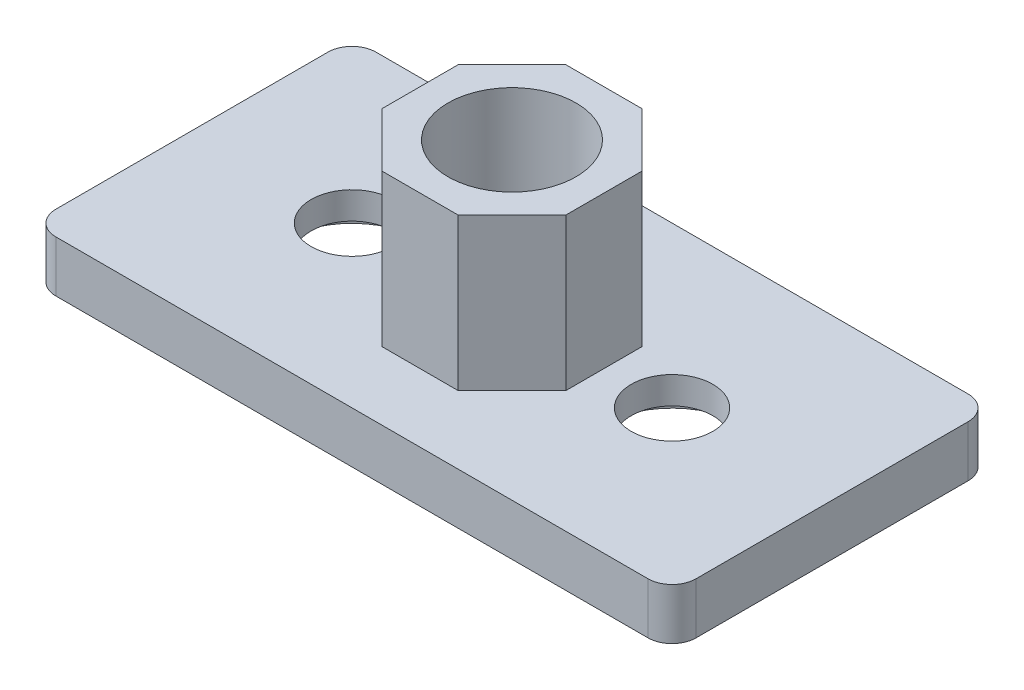
ISO-10303-21;
HEADER;
FILE_DESCRIPTION(('STEP AP214'),'2;1');
FILE_NAME('part.step','',(''),(''),'','','');
FILE_SCHEMA(('AUTOMOTIVE_DESIGN { 1 0 10303 214 1 1 1 1 }'));
ENDSEC;
DATA;
#1=APPLICATION_CONTEXT('core data for automotive mechanical design processes');
#2=APPLICATION_PROTOCOL_DEFINITION('international standard','automotive_design',2000,#1);
#3=PRODUCT_CONTEXT('',#1,'mechanical');
#4=PRODUCT('Part','Part','',(#3));
#5=PRODUCT_RELATED_PRODUCT_CATEGORY('part','',(#4));
#6=PRODUCT_DEFINITION_FORMATION('','',#4);
#7=PRODUCT_DEFINITION_CONTEXT('part definition',#1,'design');
#8=PRODUCT_DEFINITION('design','',#6,#7);
#9=PRODUCT_DEFINITION_SHAPE('','',#8);
#10=(LENGTH_UNIT() NAMED_UNIT(*) SI_UNIT(.MILLI.,.METRE.));
#11=(NAMED_UNIT(*) PLANE_ANGLE_UNIT() SI_UNIT($,.RADIAN.));
#12=(NAMED_UNIT(*) SI_UNIT($,.STERADIAN.) SOLID_ANGLE_UNIT());
#13=UNCERTAINTY_MEASURE_WITH_UNIT(LENGTH_MEASURE(1.E-05),#10,'distance_accuracy_value','');
#14=(GEOMETRIC_REPRESENTATION_CONTEXT(3) GLOBAL_UNCERTAINTY_ASSIGNED_CONTEXT((#13)) GLOBAL_UNIT_ASSIGNED_CONTEXT((#10,
#11,#12)) REPRESENTATION_CONTEXT('',''));
#15=CARTESIAN_POINT('',(0.,0.,0.));
#16=DIRECTION('',(0.,0.,1.));
#17=DIRECTION('',(1.,0.,0.));
#18=AXIS2_PLACEMENT_3D('',#15,#16,#17);
#19=CARTESIAN_POINT('',(20.,1.6,20.));
#20=DIRECTION('',(0.,-1.,0.));
#21=DIRECTION('',(1.,0.,0.));
#22=AXIS2_PLACEMENT_3D('',#19,#20,#21);
#23=PLANE('',#22);
#24=DIRECTION('',(0.,0.,-1.));
#25=VECTOR('',#24,1.);
#26=CARTESIAN_POINT('',(20.,1.6,20.));
#27=LINE('',#26,#25);
#28=CARTESIAN_POINT('',(20.,1.6,18.5));
#29=VERTEX_POINT('',#28);
#30=CARTESIAN_POINT('',(20.,1.6,1.5));
#31=VERTEX_POINT('',#30);
#32=EDGE_CURVE('E225',#29,#31,#27,.T.);
#33=ORIENTED_EDGE('',*,*,#32,.T.);
#34=CARTESIAN_POINT('',(18.5,1.6,1.5));
#35=DIRECTION('',(0.,-1.,0.));
#36=DIRECTION('',(1.,0.,0.));
#37=AXIS2_PLACEMENT_3D('',#34,#35,#36);
#38=CIRCLE('',#37,1.5);
#39=CARTESIAN_POINT('',(18.5,1.6,0.));
#40=VERTEX_POINT('',#39);
#41=EDGE_CURVE('E248',#31,#40,#38,.F.);
#42=ORIENTED_EDGE('',*,*,#41,.T.);
#43=DIRECTION('',(-1.,0.,0.));
#44=VECTOR('',#43,1.);
#45=CARTESIAN_POINT('',(20.,1.6,0.));
#46=LINE('',#45,#44);
#47=CARTESIAN_POINT('',(-18.5,1.6,0.));
#48=VERTEX_POINT('',#47);
#49=EDGE_CURVE('E215',#40,#48,#46,.T.);
#50=ORIENTED_EDGE('',*,*,#49,.T.);
#51=CARTESIAN_POINT('',(-18.5,1.6,1.5));
#52=DIRECTION('',(0.,-1.,0.));
#53=DIRECTION('',(1.,0.,0.));
#54=AXIS2_PLACEMENT_3D('',#51,#52,#53);
#55=CIRCLE('',#54,1.5);
#56=CARTESIAN_POINT('',(-20.,1.6,1.5));
#57=VERTEX_POINT('',#56);
#58=EDGE_CURVE('E244',#48,#57,#55,.F.);
#59=ORIENTED_EDGE('',*,*,#58,.T.);
#60=DIRECTION('',(0.,0.,-1.));
#61=VECTOR('',#60,1.);
#62=CARTESIAN_POINT('',(-20.,1.6,20.));
#63=LINE('',#62,#61);
#64=CARTESIAN_POINT('',(-20.,1.6,18.5));
#65=VERTEX_POINT('',#64);
#66=EDGE_CURVE('E218',#65,#57,#63,.T.);
#67=ORIENTED_EDGE('',*,*,#66,.F.);
#68=CARTESIAN_POINT('',(-18.5,1.6,18.5));
#69=DIRECTION('',(0.,-1.,0.));
#70=DIRECTION('',(1.,0.,0.));
#71=AXIS2_PLACEMENT_3D('',#68,#69,#70);
#72=CIRCLE('',#71,1.5);
#73=CARTESIAN_POINT('',(-18.5,1.6,20.));
#74=VERTEX_POINT('',#73);
#75=EDGE_CURVE('E242',#65,#74,#72,.F.);
#76=ORIENTED_EDGE('',*,*,#75,.T.);
#77=DIRECTION('',(-1.,0.,0.));
#78=VECTOR('',#77,1.);
#79=CARTESIAN_POINT('',(20.,1.6,20.));
#80=LINE('',#79,#78);
#81=CARTESIAN_POINT('',(18.5,1.6,20.));
#82=VERTEX_POINT('',#81);
#83=EDGE_CURVE('E214',#82,#74,#80,.T.);
#84=ORIENTED_EDGE('',*,*,#83,.F.);
#85=CARTESIAN_POINT('',(18.5,1.6,18.5));
#86=DIRECTION('',(0.,-1.,0.));
#87=DIRECTION('',(1.,0.,0.));
#88=AXIS2_PLACEMENT_3D('',#85,#86,#87);
#89=CIRCLE('',#88,1.5);
#90=EDGE_CURVE('E246',#82,#29,#89,.F.);
#91=ORIENTED_EDGE('',*,*,#90,.T.);
#92=EDGE_LOOP('',(#33,#42,#50,#59,#67,#76,#84,#91));
#93=FACE_BOUND('',#92,.T.);
#94=CARTESIAN_POINT('',(-10.,1.6,10.));
#95=DIRECTION('',(0.,1.,0.));
#96=DIRECTION('',(-1.,0.,0.));
#97=AXIS2_PLACEMENT_3D('',#94,#95,#96);
#98=CIRCLE('',#97,2.55);
#99=CARTESIAN_POINT('',(-12.55,1.6,10.));
#100=VERTEX_POINT('',#99);
#101=EDGE_CURVE('E207',#100,#100,#98,.T.);
#102=ORIENTED_EDGE('',*,*,#101,.F.);
#103=EDGE_LOOP('',(#102));
#104=FACE_BOUND('',#103,.T.);
#105=CARTESIAN_POINT('',(10.,1.6,10.));
#106=DIRECTION('',(0.,1.,0.));
#107=DIRECTION('',(1.,0.,0.));
#108=AXIS2_PLACEMENT_3D('',#105,#106,#107);
#109=CIRCLE('',#108,2.55);
#110=CARTESIAN_POINT('',(12.55,1.6,10.));
#111=VERTEX_POINT('',#110);
#112=EDGE_CURVE('E204',#111,#111,#109,.T.);
#113=ORIENTED_EDGE('',*,*,#112,.F.);
#114=EDGE_LOOP('',(#113));
#115=FACE_BOUND('',#114,.T.);
#116=DIRECTION('',(-1.,0.,0.));
#117=VECTOR('',#116,1.);
#118=CARTESIAN_POINT('',(2.3817279836453,1.6,4.25));
#119=LINE('',#118,#117);
#120=CARTESIAN_POINT('',(2.3817279836453,1.6,4.25));
#121=VERTEX_POINT('',#120);
#122=CARTESIAN_POINT('',(-2.3817279836453,1.6,4.25));
#123=VERTEX_POINT('',#122);
#124=EDGE_CURVE('E184',#121,#123,#119,.T.);
#125=ORIENTED_EDGE('',*,*,#124,.F.);
#126=DIRECTION('',(-0.707106781186548,0.,-0.707106781186547));
#127=VECTOR('',#126,1.);
#128=CARTESIAN_POINT('',(5.75,1.6,7.61827201635471));
#129=LINE('',#128,#127);
#130=CARTESIAN_POINT('',(5.75,1.6,7.6182720163547));
#131=VERTEX_POINT('',#130);
#132=EDGE_CURVE('E181',#131,#121,#129,.T.);
#133=ORIENTED_EDGE('',*,*,#132,.F.);
#134=DIRECTION('',(0.,0.,-1.));
#135=VECTOR('',#134,1.);
#136=CARTESIAN_POINT('',(5.75,1.6,12.3817279836453));
#137=LINE('',#136,#135);
#138=CARTESIAN_POINT('',(5.75,1.6,12.3817279836453));
#139=VERTEX_POINT('',#138);
#140=EDGE_CURVE('E549',#139,#131,#137,.T.);
#141=ORIENTED_EDGE('',*,*,#140,.F.);
#142=DIRECTION('',(0.707106781186547,0.,-0.707106781186548));
#143=VECTOR('',#142,1.);
#144=CARTESIAN_POINT('',(2.3817279836453,1.6,15.75));
#145=LINE('',#144,#143);
#146=CARTESIAN_POINT('',(2.38172798364531,1.6,15.75));
#147=VERTEX_POINT('',#146);
#148=EDGE_CURVE('E581',#147,#139,#145,.T.);
#149=ORIENTED_EDGE('',*,*,#148,.F.);
#150=DIRECTION('',(1.,0.,0.));
#151=VECTOR('',#150,1.);
#152=CARTESIAN_POINT('',(-2.38172798364529,1.6,15.75));
#153=LINE('',#152,#151);
#154=CARTESIAN_POINT('',(-2.38172798364529,1.6,15.75));
#155=VERTEX_POINT('',#154);
#156=EDGE_CURVE('E575',#155,#147,#153,.T.);
#157=ORIENTED_EDGE('',*,*,#156,.F.);
#158=DIRECTION('',(0.707106781186548,0.,0.707106781186547));
#159=VECTOR('',#158,1.);
#160=CARTESIAN_POINT('',(-5.75,1.6,12.3817279836453));
#161=LINE('',#160,#159);
#162=CARTESIAN_POINT('',(-5.74999999999999,1.6,12.3817279836453));
#163=VERTEX_POINT('',#162);
#164=EDGE_CURVE('E570',#163,#155,#161,.T.);
#165=ORIENTED_EDGE('',*,*,#164,.F.);
#166=DIRECTION('',(0.,0.,1.));
#167=VECTOR('',#166,1.);
#168=CARTESIAN_POINT('',(-5.75,1.6,7.61827201635471));
#169=LINE('',#168,#167);
#170=CARTESIAN_POINT('',(-5.75,1.6,7.61827201635471));
#171=VERTEX_POINT('',#170);
#172=EDGE_CURVE('E573',#171,#163,#169,.T.);
#173=ORIENTED_EDGE('',*,*,#172,.F.);
#174=DIRECTION('',(-0.707106781186547,0.,0.707106781186548));
#175=VECTOR('',#174,1.);
#176=CARTESIAN_POINT('',(-2.38172798364529,1.6,4.25));
#177=LINE('',#176,#175);
#178=EDGE_CURVE('E542',#123,#171,#177,.T.);
#179=ORIENTED_EDGE('',*,*,#178,.F.);
#180=EDGE_LOOP('',(#125,#133,#141,#149,#157,#165,#173,#179));
#181=FACE_BOUND('',#180,.T.);
#182=ADVANCED_FACE('F46',(#93,#104,#115,#181),#23,.F.);
#183=CARTESIAN_POINT('',(-10.,-1.60000000000001,10.));
#184=DIRECTION('',(0.,1.,0.));
#185=DIRECTION('',(-1.,0.,0.));
#186=AXIS2_PLACEMENT_3D('',#183,#184,#185);
#187=CYLINDRICAL_SURFACE('',#186,2.55);
#188=ORIENTED_EDGE('',*,*,#101,.T.);
#189=EDGE_LOOP('',(#188));
#190=FACE_BOUND('',#189,.T.);
#191=CARTESIAN_POINT('',(-10.,-0.100000000000002,10.));
#192=DIRECTION('',(0.,-1.,0.));
#193=DIRECTION('',(1.,0.,0.));
#194=AXIS2_PLACEMENT_3D('',#191,#192,#193);
#195=CIRCLE('',#194,2.55);
#196=CARTESIAN_POINT('',(-7.45,-0.100000000000001,10.));
#197=VERTEX_POINT('',#196);
#198=EDGE_CURVE('E195',#197,#197,#195,.F.);
#199=ORIENTED_EDGE('',*,*,#198,.F.);
#200=EDGE_LOOP('',(#199));
#201=FACE_BOUND('',#200,.T.);
#202=ADVANCED_FACE('F305',(#190,#201),#187,.F.);
#203=CARTESIAN_POINT('',(10.,-1.6,10.));
#204=DIRECTION('',(0.,1.,0.));
#205=DIRECTION('',(-1.,0.,0.));
#206=AXIS2_PLACEMENT_3D('',#203,#204,#205);
#207=CYLINDRICAL_SURFACE('',#206,2.55);
#208=ORIENTED_EDGE('',*,*,#112,.T.);
#209=EDGE_LOOP('',(#208));
#210=FACE_BOUND('',#209,.T.);
#211=CARTESIAN_POINT('',(10.,-0.0999999999999987,10.));
#212=DIRECTION('',(0.,-1.,0.));
#213=DIRECTION('',(1.,0.,0.));
#214=AXIS2_PLACEMENT_3D('',#211,#212,#213);
#215=CIRCLE('',#214,2.55);
#216=CARTESIAN_POINT('',(12.55,-0.0999999999999984,10.));
#217=VERTEX_POINT('',#216);
#218=EDGE_CURVE('E200',#217,#217,#215,.F.);
#219=ORIENTED_EDGE('',*,*,#218,.F.);
#220=EDGE_LOOP('',(#219));
#221=FACE_BOUND('',#220,.T.);
#222=ADVANCED_FACE('F310',(#210,#221),#207,.F.);
#223=CARTESIAN_POINT('',(-20.,-1.6,20.));
#224=DIRECTION('',(1.,0.,0.));
#225=DIRECTION('',(0.,0.,-1.));
#226=AXIS2_PLACEMENT_3D('',#223,#224,#225);
#227=PLANE('',#226);
#228=ORIENTED_EDGE('',*,*,#66,.T.);
#229=DIRECTION('',(0.,-1.,0.));
#230=VECTOR('',#229,1.);
#231=CARTESIAN_POINT('',(-20.,-1.6,1.5));
#232=LINE('',#231,#230);
#233=CARTESIAN_POINT('',(-20.,-1.6,1.5));
#234=VERTEX_POINT('',#233);
#235=EDGE_CURVE('E13',#57,#234,#232,.T.);
#236=ORIENTED_EDGE('',*,*,#235,.T.);
#237=DIRECTION('',(0.,0.,-1.));
#238=VECTOR('',#237,1.);
#239=CARTESIAN_POINT('',(-20.,-1.6,20.));
#240=LINE('',#239,#238);
#241=CARTESIAN_POINT('',(-20.,-1.6,18.5));
#242=VERTEX_POINT('',#241);
#243=EDGE_CURVE('E231',#242,#234,#240,.T.);
#244=ORIENTED_EDGE('',*,*,#243,.F.);
#245=DIRECTION('',(0.,-1.,0.));
#246=VECTOR('',#245,1.);
#247=CARTESIAN_POINT('',(-20.,1.6,18.5));
#248=LINE('',#247,#246);
#249=EDGE_CURVE('E54',#242,#65,#248,.F.);
#250=ORIENTED_EDGE('',*,*,#249,.T.);
#251=EDGE_LOOP('',(#228,#236,#244,#250));
#252=FACE_BOUND('',#251,.T.);
#253=ADVANCED_FACE('F268',(#252),#227,.F.);
#254=CARTESIAN_POINT('',(20.,-1.6,20.));
#255=DIRECTION('',(0.,1.,0.));
#256=DIRECTION('',(-1.,0.,0.));
#257=AXIS2_PLACEMENT_3D('',#254,#255,#256);
#258=PLANE('',#257);
#259=CARTESIAN_POINT('',(0.,-1.6,10.));
#260=DIRECTION('',(0.,1.,0.));
#261=DIRECTION('',(-1.,0.,0.));
#262=AXIS2_PLACEMENT_3D('',#259,#260,#261);
#263=CIRCLE('',#262,4.);
#264=CARTESIAN_POINT('',(-4.,-1.6,10.));
#265=VERTEX_POINT('',#264);
#266=EDGE_CURVE('E543',#265,#265,#263,.T.);
#267=ORIENTED_EDGE('',*,*,#266,.T.);
#268=EDGE_LOOP('',(#267));
#269=FACE_BOUND('',#268,.T.);
#270=CARTESIAN_POINT('',(-10.,-1.6,10.));
#271=DIRECTION('',(0.,-1.,0.));
#272=DIRECTION('',(1.,0.,0.));
#273=AXIS2_PLACEMENT_3D('',#270,#271,#272);
#274=CIRCLE('',#273,4.5);
#275=CARTESIAN_POINT('',(-5.5,-1.6,10.));
#276=VERTEX_POINT('',#275);
#277=EDGE_CURVE('E185',#276,#276,#274,.T.);
#278=ORIENTED_EDGE('',*,*,#277,.F.);
#279=EDGE_LOOP('',(#278));
#280=FACE_BOUND('',#279,.T.);
#281=CARTESIAN_POINT('',(10.,-1.6,10.));
#282=DIRECTION('',(0.,-1.,0.));
#283=DIRECTION('',(1.,0.,0.));
#284=AXIS2_PLACEMENT_3D('',#281,#282,#283);
#285=CIRCLE('',#284,4.5);
#286=CARTESIAN_POINT('',(14.5,-1.6,10.));
#287=VERTEX_POINT('',#286);
#288=EDGE_CURVE('E201',#287,#287,#285,.T.);
#289=ORIENTED_EDGE('',*,*,#288,.F.);
#290=EDGE_LOOP('',(#289));
#291=FACE_BOUND('',#290,.T.);
#292=DIRECTION('',(1.,0.,0.));
#293=VECTOR('',#292,1.);
#294=CARTESIAN_POINT('',(20.,-1.6,0.));
#295=LINE('',#294,#293);
#296=CARTESIAN_POINT('',(-18.5,-1.6,0.));
#297=VERTEX_POINT('',#296);
#298=CARTESIAN_POINT('',(18.5,-1.6,0.));
#299=VERTEX_POINT('',#298);
#300=EDGE_CURVE('E210',#297,#299,#295,.T.);
#301=ORIENTED_EDGE('',*,*,#300,.T.);
#302=CARTESIAN_POINT('',(18.5,-1.6,1.5));
#303=DIRECTION('',(0.,1.,0.));
#304=DIRECTION('',(-1.,0.,0.));
#305=AXIS2_PLACEMENT_3D('',#302,#303,#304);
#306=CIRCLE('',#305,1.5);
#307=CARTESIAN_POINT('',(20.,-1.6,1.5));
#308=VERTEX_POINT('',#307);
#309=EDGE_CURVE('E258',#299,#308,#306,.F.);
#310=ORIENTED_EDGE('',*,*,#309,.T.);
#311=DIRECTION('',(0.,0.,-1.));
#312=VECTOR('',#311,1.);
#313=CARTESIAN_POINT('',(20.,-1.6,20.));
#314=LINE('',#313,#312);
#315=CARTESIAN_POINT('',(20.,-1.6,18.5));
#316=VERTEX_POINT('',#315);
#317=EDGE_CURVE('E228',#316,#308,#314,.T.);
#318=ORIENTED_EDGE('',*,*,#317,.F.);
#319=CARTESIAN_POINT('',(18.5,-1.6,18.5));
#320=DIRECTION('',(0.,1.,0.));
#321=DIRECTION('',(-1.,0.,0.));
#322=AXIS2_PLACEMENT_3D('',#319,#320,#321);
#323=CIRCLE('',#322,1.5);
#324=CARTESIAN_POINT('',(18.5,-1.6,20.));
#325=VERTEX_POINT('',#324);
#326=EDGE_CURVE('E256',#316,#325,#323,.F.);
#327=ORIENTED_EDGE('',*,*,#326,.T.);
#328=DIRECTION('',(1.,0.,0.));
#329=VECTOR('',#328,1.);
#330=CARTESIAN_POINT('',(20.,-1.6,20.));
#331=LINE('',#330,#329);
#332=CARTESIAN_POINT('',(-18.5,-1.6,20.));
#333=VERTEX_POINT('',#332);
#334=EDGE_CURVE('E211',#333,#325,#331,.T.);
#335=ORIENTED_EDGE('',*,*,#334,.F.);
#336=CARTESIAN_POINT('',(-18.5,-1.6,18.5));
#337=DIRECTION('',(0.,1.,0.));
#338=DIRECTION('',(-1.,0.,0.));
#339=AXIS2_PLACEMENT_3D('',#336,#337,#338);
#340=CIRCLE('',#339,1.5);
#341=EDGE_CURVE('E68',#333,#242,#340,.F.);
#342=ORIENTED_EDGE('',*,*,#341,.T.);
#343=ORIENTED_EDGE('',*,*,#243,.T.);
#344=CARTESIAN_POINT('',(-18.5,-1.6,1.5));
#345=DIRECTION('',(0.,1.,0.));
#346=DIRECTION('',(-1.,0.,0.));
#347=AXIS2_PLACEMENT_3D('',#344,#345,#346);
#348=CIRCLE('',#347,1.5);
#349=EDGE_CURVE('E61',#234,#297,#348,.F.);
#350=ORIENTED_EDGE('',*,*,#349,.T.);
#351=EDGE_LOOP('',(#301,#310,#318,#327,#335,#342,#343,#350));
#352=FACE_BOUND('',#351,.T.);
#353=ADVANCED_FACE('F279',(#269,#280,#291,#352),#258,.F.);
#354=CARTESIAN_POINT('',(20.,-1.6,20.));
#355=DIRECTION('',(-1.,0.,0.));
#356=DIRECTION('',(0.,0.,1.));
#357=AXIS2_PLACEMENT_3D('',#354,#355,#356);
#358=PLANE('',#357);
#359=ORIENTED_EDGE('',*,*,#317,.T.);
#360=DIRECTION('',(0.,1.,0.));
#361=VECTOR('',#360,1.);
#362=CARTESIAN_POINT('',(20.,-1.6,1.5));
#363=LINE('',#362,#361);
#364=EDGE_CURVE('E239',#308,#31,#363,.T.);
#365=ORIENTED_EDGE('',*,*,#364,.T.);
#366=ORIENTED_EDGE('',*,*,#32,.F.);
#367=DIRECTION('',(0.,1.,0.));
#368=VECTOR('',#367,1.);
#369=CARTESIAN_POINT('',(20.,-1.6,18.5));
#370=LINE('',#369,#368);
#371=EDGE_CURVE('E233',#29,#316,#370,.F.);
#372=ORIENTED_EDGE('',*,*,#371,.T.);
#373=EDGE_LOOP('',(#359,#365,#366,#372));
#374=FACE_BOUND('',#373,.T.);
#375=ADVANCED_FACE('F287',(#374),#358,.F.);
#376=CARTESIAN_POINT('',(0.,0.,20.));
#377=DIRECTION('',(0.,0.,1.));
#378=DIRECTION('',(1.,0.,0.));
#379=AXIS2_PLACEMENT_3D('',#376,#377,#378);
#380=PLANE('',#379);
#381=ORIENTED_EDGE('',*,*,#334,.T.);
#382=DIRECTION('',(0.,1.,0.));
#383=VECTOR('',#382,1.);
#384=CARTESIAN_POINT('',(18.5,1.6,20.));
#385=LINE('',#384,#383);
#386=EDGE_CURVE('E263',#325,#82,#385,.T.);
#387=ORIENTED_EDGE('',*,*,#386,.T.);
#388=ORIENTED_EDGE('',*,*,#83,.T.);
#389=DIRECTION('',(0.,-1.,0.));
#390=VECTOR('',#389,1.);
#391=CARTESIAN_POINT('',(-18.5,-1.6,20.));
#392=LINE('',#391,#390);
#393=EDGE_CURVE('E260',#74,#333,#392,.T.);
#394=ORIENTED_EDGE('',*,*,#393,.T.);
#395=EDGE_LOOP('',(#381,#387,#388,#394));
#396=FACE_BOUND('',#395,.T.);
#397=ADVANCED_FACE('F277',(#396),#380,.T.);
#398=CARTESIAN_POINT('',(0.,0.,0.));
#399=DIRECTION('',(0.,0.,1.));
#400=DIRECTION('',(1.,0.,0.));
#401=AXIS2_PLACEMENT_3D('',#398,#399,#400);
#402=PLANE('',#401);
#403=ORIENTED_EDGE('',*,*,#49,.F.);
#404=DIRECTION('',(0.,1.,0.));
#405=VECTOR('',#404,1.);
#406=CARTESIAN_POINT('',(18.5,0.,0.));
#407=LINE('',#406,#405);
#408=EDGE_CURVE('E252',#40,#299,#407,.F.);
#409=ORIENTED_EDGE('',*,*,#408,.T.);
#410=ORIENTED_EDGE('',*,*,#300,.F.);
#411=DIRECTION('',(0.,-1.,0.));
#412=VECTOR('',#411,1.);
#413=CARTESIAN_POINT('',(-18.5,0.,0.));
#414=LINE('',#413,#412);
#415=EDGE_CURVE('E250',#297,#48,#414,.F.);
#416=ORIENTED_EDGE('',*,*,#415,.T.);
#417=EDGE_LOOP('',(#403,#409,#410,#416));
#418=FACE_BOUND('',#417,.T.);
#419=ADVANCED_FACE('F295',(#418),#402,.F.);
#420=CARTESIAN_POINT('',(10.,-0.0999999999999987,10.));
#421=DIRECTION('',(0.,-1.,0.));
#422=DIRECTION('',(1.,0.,0.));
#423=AXIS2_PLACEMENT_3D('',#420,#421,#422);
#424=PLANE('',#423);
#425=CARTESIAN_POINT('',(10.,-0.0999999999999987,10.));
#426=DIRECTION('',(0.,-1.,0.));
#427=DIRECTION('',(1.,0.,0.));
#428=AXIS2_PLACEMENT_3D('',#425,#426,#427);
#429=CIRCLE('',#428,4.5);
#430=CARTESIAN_POINT('',(14.5,-0.099999999999998,10.));
#431=VERTEX_POINT('',#430);
#432=EDGE_CURVE('E197',#431,#431,#429,.T.);
#433=ORIENTED_EDGE('',*,*,#432,.T.);
#434=EDGE_LOOP('',(#433));
#435=FACE_BOUND('',#434,.T.);
#436=ORIENTED_EDGE('',*,*,#218,.T.);
#437=EDGE_LOOP('',(#436));
#438=FACE_BOUND('',#437,.T.);
#439=ADVANCED_FACE('F375',(#435,#438),#424,.T.);
#440=CARTESIAN_POINT('',(10.,-0.0999999999999987,10.));
#441=DIRECTION('',(0.,-1.,0.));
#442=DIRECTION('',(1.,0.,0.));
#443=AXIS2_PLACEMENT_3D('',#440,#441,#442);
#444=CYLINDRICAL_SURFACE('',#443,4.5);
#445=ORIENTED_EDGE('',*,*,#432,.F.);
#446=EDGE_LOOP('',(#445));
#447=FACE_BOUND('',#446,.T.);
#448=ORIENTED_EDGE('',*,*,#288,.T.);
#449=EDGE_LOOP('',(#448));
#450=FACE_BOUND('',#449,.T.);
#451=ADVANCED_FACE('F370',(#447,#450),#444,.F.);
#452=CARTESIAN_POINT('',(-10.,-0.100000000000002,10.));
#453=DIRECTION('',(0.,-1.,0.));
#454=DIRECTION('',(1.,0.,0.));
#455=AXIS2_PLACEMENT_3D('',#452,#453,#454);
#456=PLANE('',#455);
#457=CARTESIAN_POINT('',(-10.,-0.100000000000002,10.));
#458=DIRECTION('',(0.,-1.,0.));
#459=DIRECTION('',(1.,0.,0.));
#460=AXIS2_PLACEMENT_3D('',#457,#458,#459);
#461=CIRCLE('',#460,4.5);
#462=CARTESIAN_POINT('',(-5.5,-0.100000000000001,10.));
#463=VERTEX_POINT('',#462);
#464=EDGE_CURVE('E188',#463,#463,#461,.T.);
#465=ORIENTED_EDGE('',*,*,#464,.T.);
#466=EDGE_LOOP('',(#465));
#467=FACE_BOUND('',#466,.T.);
#468=ORIENTED_EDGE('',*,*,#198,.T.);
#469=EDGE_LOOP('',(#468));
#470=FACE_BOUND('',#469,.T.);
#471=ADVANCED_FACE('F367',(#467,#470),#456,.T.);
#472=CARTESIAN_POINT('',(-10.,-0.100000000000002,10.));
#473=DIRECTION('',(0.,-1.,0.));
#474=DIRECTION('',(1.,0.,0.));
#475=AXIS2_PLACEMENT_3D('',#472,#473,#474);
#476=CYLINDRICAL_SURFACE('',#475,4.5);
#477=ORIENTED_EDGE('',*,*,#464,.F.);
#478=EDGE_LOOP('',(#477));
#479=FACE_BOUND('',#478,.T.);
#480=ORIENTED_EDGE('',*,*,#277,.T.);
#481=EDGE_LOOP('',(#480));
#482=FACE_BOUND('',#481,.T.);
#483=ADVANCED_FACE('F366',(#479,#482),#476,.F.);
#484=CARTESIAN_POINT('',(2.3817279836453,11.1,4.25));
#485=DIRECTION('',(0.,0.,1.));
#486=DIRECTION('',(1.,0.,0.));
#487=AXIS2_PLACEMENT_3D('',#484,#485,#486);
#488=PLANE('',#487);
#489=ORIENTED_EDGE('',*,*,#124,.T.);
#490=DIRECTION('',(0.,-1.,0.));
#491=VECTOR('',#490,1.);
#492=CARTESIAN_POINT('',(-2.3817279836453,11.1,4.25));
#493=LINE('',#492,#491);
#494=CARTESIAN_POINT('',(-2.3817279836453,11.1,4.25));
#495=VERTEX_POINT('',#494);
#496=EDGE_CURVE('E165',#495,#123,#493,.T.);
#497=ORIENTED_EDGE('',*,*,#496,.F.);
#498=DIRECTION('',(-1.,0.,0.));
#499=VECTOR('',#498,1.);
#500=CARTESIAN_POINT('',(2.3817279836453,11.1,4.25));
#501=LINE('',#500,#499);
#502=CARTESIAN_POINT('',(2.3817279836453,11.1,4.25));
#503=VERTEX_POINT('',#502);
#504=EDGE_CURVE('E172',#503,#495,#501,.T.);
#505=ORIENTED_EDGE('',*,*,#504,.F.);
#506=DIRECTION('',(0.,-1.,0.));
#507=VECTOR('',#506,1.);
#508=CARTESIAN_POINT('',(2.3817279836453,11.1,4.25));
#509=LINE('',#508,#507);
#510=EDGE_CURVE('E546',#503,#121,#509,.T.);
#511=ORIENTED_EDGE('',*,*,#510,.T.);
#512=EDGE_LOOP('',(#489,#497,#505,#511));
#513=FACE_BOUND('',#512,.T.);
#514=ADVANCED_FACE('F183',(#513),#488,.F.);
#515=CARTESIAN_POINT('',(-2.3817279836453,11.1,4.25));
#516=DIRECTION('',(0.707106781186548,0.,0.707106781186547));
#517=DIRECTION('',(0.707106781186547,0.,-0.707106781186548));
#518=AXIS2_PLACEMENT_3D('',#515,#516,#517);
#519=PLANE('',#518);
#520=ORIENTED_EDGE('',*,*,#178,.T.);
#521=DIRECTION('',(0.,-1.,0.));
#522=VECTOR('',#521,1.);
#523=CARTESIAN_POINT('',(-5.75,11.1,7.61827201635471));
#524=LINE('',#523,#522);
#525=CARTESIAN_POINT('',(-5.75,11.1,7.61827201635471));
#526=VERTEX_POINT('',#525);
#527=EDGE_CURVE('E168',#526,#171,#524,.T.);
#528=ORIENTED_EDGE('',*,*,#527,.F.);
#529=DIRECTION('',(-0.707106781186547,0.,0.707106781186548));
#530=VECTOR('',#529,1.);
#531=CARTESIAN_POINT('',(-2.3817279836453,11.1,4.25));
#532=LINE('',#531,#530);
#533=EDGE_CURVE('E160',#495,#526,#532,.T.);
#534=ORIENTED_EDGE('',*,*,#533,.F.);
#535=ORIENTED_EDGE('',*,*,#496,.T.);
#536=EDGE_LOOP('',(#520,#528,#534,#535));
#537=FACE_BOUND('',#536,.T.);
#538=ADVANCED_FACE('F163',(#537),#519,.F.);
#539=CARTESIAN_POINT('',(-5.75,11.1,7.61827201635471));
#540=DIRECTION('',(1.,0.,0.));
#541=DIRECTION('',(0.,0.,-1.));
#542=AXIS2_PLACEMENT_3D('',#539,#540,#541);
#543=PLANE('',#542);
#544=ORIENTED_EDGE('',*,*,#172,.T.);
#545=DIRECTION('',(0.,-1.,0.));
#546=VECTOR('',#545,1.);
#547=CARTESIAN_POINT('',(-5.75,11.1,12.3817279836453));
#548=LINE('',#547,#546);
#549=CARTESIAN_POINT('',(-5.75,11.1,12.3817279836453));
#550=VERTEX_POINT('',#549);
#551=EDGE_CURVE('E190',#550,#163,#548,.T.);
#552=ORIENTED_EDGE('',*,*,#551,.F.);
#553=DIRECTION('',(0.,0.,1.));
#554=VECTOR('',#553,1.);
#555=CARTESIAN_POINT('',(-5.75,11.1,7.61827201635471));
#556=LINE('',#555,#554);
#557=EDGE_CURVE('E171',#526,#550,#556,.T.);
#558=ORIENTED_EDGE('',*,*,#557,.F.);
#559=ORIENTED_EDGE('',*,*,#527,.T.);
#560=EDGE_LOOP('',(#544,#552,#558,#559));
#561=FACE_BOUND('',#560,.T.);
#562=ADVANCED_FACE('F357',(#561),#543,.F.);
#563=CARTESIAN_POINT('',(-5.75,11.1,12.3817279836453));
#564=DIRECTION('',(0.707106781186547,0.,-0.707106781186548));
#565=DIRECTION('',(-0.707106781186548,0.,-0.707106781186547));
#566=AXIS2_PLACEMENT_3D('',#563,#564,#565);
#567=PLANE('',#566);
#568=ORIENTED_EDGE('',*,*,#164,.T.);
#569=DIRECTION('',(0.,-1.,0.));
#570=VECTOR('',#569,1.);
#571=CARTESIAN_POINT('',(-2.38172798364529,11.1,15.75));
#572=LINE('',#571,#570);
#573=CARTESIAN_POINT('',(-2.38172798364529,11.1,15.75));
#574=VERTEX_POINT('',#573);
#575=EDGE_CURVE('E563',#574,#155,#572,.T.);
#576=ORIENTED_EDGE('',*,*,#575,.F.);
#577=DIRECTION('',(0.707106781186548,0.,0.707106781186547));
#578=VECTOR('',#577,1.);
#579=CARTESIAN_POINT('',(-5.75,11.1,12.3817279836453));
#580=LINE('',#579,#578);
#581=EDGE_CURVE('E571',#550,#574,#580,.T.);
#582=ORIENTED_EDGE('',*,*,#581,.F.);
#583=ORIENTED_EDGE('',*,*,#551,.T.);
#584=EDGE_LOOP('',(#568,#576,#582,#583));
#585=FACE_BOUND('',#584,.T.);
#586=ADVANCED_FACE('F353',(#585),#567,.F.);
#587=CARTESIAN_POINT('',(-2.38172798364529,11.1,15.75));
#588=DIRECTION('',(0.,0.,-1.));
#589=DIRECTION('',(-1.,0.,0.));
#590=AXIS2_PLACEMENT_3D('',#587,#588,#589);
#591=PLANE('',#590);
#592=ORIENTED_EDGE('',*,*,#156,.T.);
#593=DIRECTION('',(0.,-1.,0.));
#594=VECTOR('',#593,1.);
#595=CARTESIAN_POINT('',(2.3817279836453,11.1,15.75));
#596=LINE('',#595,#594);
#597=CARTESIAN_POINT('',(2.3817279836453,11.1,15.75));
#598=VERTEX_POINT('',#597);
#599=EDGE_CURVE('E560',#598,#147,#596,.T.);
#600=ORIENTED_EDGE('',*,*,#599,.F.);
#601=DIRECTION('',(1.,0.,0.));
#602=VECTOR('',#601,1.);
#603=CARTESIAN_POINT('',(-2.38172798364529,11.1,15.75));
#604=LINE('',#603,#602);
#605=EDGE_CURVE('E589',#574,#598,#604,.T.);
#606=ORIENTED_EDGE('',*,*,#605,.F.);
#607=ORIENTED_EDGE('',*,*,#575,.T.);
#608=EDGE_LOOP('',(#592,#600,#606,#607));
#609=FACE_BOUND('',#608,.T.);
#610=ADVANCED_FACE('F349',(#609),#591,.F.);
#611=CARTESIAN_POINT('',(2.3817279836453,11.1,15.75));
#612=DIRECTION('',(-0.707106781186548,0.,-0.707106781186547));
#613=DIRECTION('',(-0.707106781186547,0.,0.707106781186548));
#614=AXIS2_PLACEMENT_3D('',#611,#612,#613);
#615=PLANE('',#614);
#616=ORIENTED_EDGE('',*,*,#148,.T.);
#617=DIRECTION('',(0.,-1.,0.));
#618=VECTOR('',#617,1.);
#619=CARTESIAN_POINT('',(5.75,11.1,12.3817279836453));
#620=LINE('',#619,#618);
#621=CARTESIAN_POINT('',(5.75,11.1,12.3817279836453));
#622=VERTEX_POINT('',#621);
#623=EDGE_CURVE('E552',#622,#139,#620,.T.);
#624=ORIENTED_EDGE('',*,*,#623,.F.);
#625=DIRECTION('',(0.707106781186547,0.,-0.707106781186548));
#626=VECTOR('',#625,1.);
#627=CARTESIAN_POINT('',(2.3817279836453,11.1,15.75));
#628=LINE('',#627,#626);
#629=EDGE_CURVE('E587',#598,#622,#628,.T.);
#630=ORIENTED_EDGE('',*,*,#629,.F.);
#631=ORIENTED_EDGE('',*,*,#599,.T.);
#632=EDGE_LOOP('',(#616,#624,#630,#631));
#633=FACE_BOUND('',#632,.T.);
#634=ADVANCED_FACE('F345',(#633),#615,.F.);
#635=CARTESIAN_POINT('',(5.75,11.1,12.3817279836453));
#636=DIRECTION('',(-1.,0.,0.));
#637=DIRECTION('',(0.,0.,1.));
#638=AXIS2_PLACEMENT_3D('',#635,#636,#637);
#639=PLANE('',#638);
#640=ORIENTED_EDGE('',*,*,#140,.T.);
#641=DIRECTION('',(0.,-1.,0.));
#642=VECTOR('',#641,1.);
#643=CARTESIAN_POINT('',(5.75,11.1,7.61827201635471));
#644=LINE('',#643,#642);
#645=CARTESIAN_POINT('',(5.75,11.1,7.61827201635471));
#646=VERTEX_POINT('',#645);
#647=EDGE_CURVE('E548',#646,#131,#644,.T.);
#648=ORIENTED_EDGE('',*,*,#647,.F.);
#649=DIRECTION('',(0.,0.,-1.));
#650=VECTOR('',#649,1.);
#651=CARTESIAN_POINT('',(5.75,11.1,12.3817279836453));
#652=LINE('',#651,#650);
#653=EDGE_CURVE('E554',#622,#646,#652,.T.);
#654=ORIENTED_EDGE('',*,*,#653,.F.);
#655=ORIENTED_EDGE('',*,*,#623,.T.);
#656=EDGE_LOOP('',(#640,#648,#654,#655));
#657=FACE_BOUND('',#656,.T.);
#658=ADVANCED_FACE('F341',(#657),#639,.F.);
#659=CARTESIAN_POINT('',(5.75,11.1,7.61827201635471));
#660=DIRECTION('',(-0.707106781186548,0.,0.707106781186548));
#661=DIRECTION('',(0.707106781186548,0.,0.707106781186547));
#662=AXIS2_PLACEMENT_3D('',#659,#660,#661);
#663=PLANE('',#662);
#664=ORIENTED_EDGE('',*,*,#132,.T.);
#665=ORIENTED_EDGE('',*,*,#510,.F.);
#666=DIRECTION('',(-0.707106781186548,0.,-0.707106781186547));
#667=VECTOR('',#666,1.);
#668=CARTESIAN_POINT('',(5.75,11.1,7.61827201635471));
#669=LINE('',#668,#667);
#670=EDGE_CURVE('E177',#646,#503,#669,.T.);
#671=ORIENTED_EDGE('',*,*,#670,.F.);
#672=ORIENTED_EDGE('',*,*,#647,.T.);
#673=EDGE_LOOP('',(#664,#665,#671,#672));
#674=FACE_BOUND('',#673,.T.);
#675=ADVANCED_FACE('F333',(#674),#663,.F.);
#676=CARTESIAN_POINT('',(0.,11.1,0.));
#677=DIRECTION('',(0.,1.,0.));
#678=DIRECTION('',(-1.,0.,0.));
#679=AXIS2_PLACEMENT_3D('',#676,#677,#678);
#680=PLANE('',#679);
#681=CARTESIAN_POINT('',(0.,11.1,10.));
#682=DIRECTION('',(0.,1.,0.));
#683=DIRECTION('',(-1.,0.,0.));
#684=AXIS2_PLACEMENT_3D('',#681,#682,#683);
#685=CIRCLE('',#684,4.);
#686=CARTESIAN_POINT('',(-4.,11.1,10.));
#687=VERTEX_POINT('',#686);
#688=EDGE_CURVE('E596',#687,#687,#685,.T.);
#689=ORIENTED_EDGE('',*,*,#688,.F.);
#690=EDGE_LOOP('',(#689));
#691=FACE_BOUND('',#690,.T.);
#692=ORIENTED_EDGE('',*,*,#504,.T.);
#693=ORIENTED_EDGE('',*,*,#533,.T.);
#694=ORIENTED_EDGE('',*,*,#557,.T.);
#695=ORIENTED_EDGE('',*,*,#581,.T.);
#696=ORIENTED_EDGE('',*,*,#605,.T.);
#697=ORIENTED_EDGE('',*,*,#629,.T.);
#698=ORIENTED_EDGE('',*,*,#653,.T.);
#699=ORIENTED_EDGE('',*,*,#670,.T.);
#700=EDGE_LOOP('',(#692,#693,#694,#695,#696,#697,#698,#699));
#701=FACE_BOUND('',#700,.T.);
#702=ADVANCED_FACE('F175',(#691,#701),#680,.T.);
#703=CARTESIAN_POINT('',(0.,-1.6,10.));
#704=DIRECTION('',(0.,1.,0.));
#705=DIRECTION('',(-1.,0.,0.));
#706=AXIS2_PLACEMENT_3D('',#703,#704,#705);
#707=CYLINDRICAL_SURFACE('',#706,4.);
#708=ORIENTED_EDGE('',*,*,#266,.F.);
#709=EDGE_LOOP('',(#708));
#710=FACE_BOUND('',#709,.T.);
#711=ORIENTED_EDGE('',*,*,#688,.T.);
#712=EDGE_LOOP('',(#711));
#713=FACE_BOUND('',#712,.T.);
#714=ADVANCED_FACE('F324',(#710,#713),#707,.F.);
#715=CARTESIAN_POINT('',(18.5,-1.6,1.5));
#716=DIRECTION('',(0.,1.,0.));
#717=DIRECTION('',(0.,0.,1.));
#718=AXIS2_PLACEMENT_3D('',#715,#716,#717);
#719=CYLINDRICAL_SURFACE('',#718,1.5);
#720=ORIENTED_EDGE('',*,*,#309,.F.);
#721=ORIENTED_EDGE('',*,*,#408,.F.);
#722=ORIENTED_EDGE('',*,*,#41,.F.);
#723=ORIENTED_EDGE('',*,*,#364,.F.);
#724=EDGE_LOOP('',(#720,#721,#722,#723));
#725=FACE_BOUND('',#724,.T.);
#726=ADVANCED_FACE('F291',(#725),#719,.T.);
#727=CARTESIAN_POINT('',(18.5,0.,18.5));
#728=DIRECTION('',(0.,-1.,0.));
#729=DIRECTION('',(0.,0.,-1.));
#730=AXIS2_PLACEMENT_3D('',#727,#728,#729);
#731=CYLINDRICAL_SURFACE('',#730,1.5);
#732=ORIENTED_EDGE('',*,*,#326,.F.);
#733=ORIENTED_EDGE('',*,*,#371,.F.);
#734=ORIENTED_EDGE('',*,*,#90,.F.);
#735=ORIENTED_EDGE('',*,*,#386,.F.);
#736=EDGE_LOOP('',(#732,#733,#734,#735));
#737=FACE_BOUND('',#736,.T.);
#738=ADVANCED_FACE('F284',(#737),#731,.T.);
#739=CARTESIAN_POINT('',(-18.5,-1.6,1.5));
#740=DIRECTION('',(0.,-1.,0.));
#741=DIRECTION('',(0.,0.,-1.));
#742=AXIS2_PLACEMENT_3D('',#739,#740,#741);
#743=CYLINDRICAL_SURFACE('',#742,1.5);
#744=ORIENTED_EDGE('',*,*,#58,.F.);
#745=ORIENTED_EDGE('',*,*,#415,.F.);
#746=ORIENTED_EDGE('',*,*,#349,.F.);
#747=ORIENTED_EDGE('',*,*,#235,.F.);
#748=EDGE_LOOP('',(#744,#745,#746,#747));
#749=FACE_BOUND('',#748,.T.);
#750=ADVANCED_FACE('F297',(#749),#743,.T.);
#751=CARTESIAN_POINT('',(-18.5,0.,18.5));
#752=DIRECTION('',(0.,1.,0.));
#753=DIRECTION('',(0.,0.,1.));
#754=AXIS2_PLACEMENT_3D('',#751,#752,#753);
#755=CYLINDRICAL_SURFACE('',#754,1.5);
#756=ORIENTED_EDGE('',*,*,#75,.F.);
#757=ORIENTED_EDGE('',*,*,#249,.F.);
#758=ORIENTED_EDGE('',*,*,#341,.F.);
#759=ORIENTED_EDGE('',*,*,#393,.F.);
#760=EDGE_LOOP('',(#756,#757,#758,#759));
#761=FACE_BOUND('',#760,.T.);
#762=ADVANCED_FACE('F48',(#761),#755,.T.);
#763=CLOSED_SHELL('',(#182,#202,#222,#253,#353,#375,#397,#419,#439,#451,#471,#483,#514,#538,
#562,#586,#610,#634,#658,#675,#702,#714,#726,#738,#750,#762));
#764=MANIFOLD_SOLID_BREP('B2',#763);
#765=ADVANCED_BREP_SHAPE_REPRESENTATION('',(#18,#764),#14);
#766=SHAPE_DEFINITION_REPRESENTATION(#9,#765);
ENDSEC;
END-ISO-10303-21;
